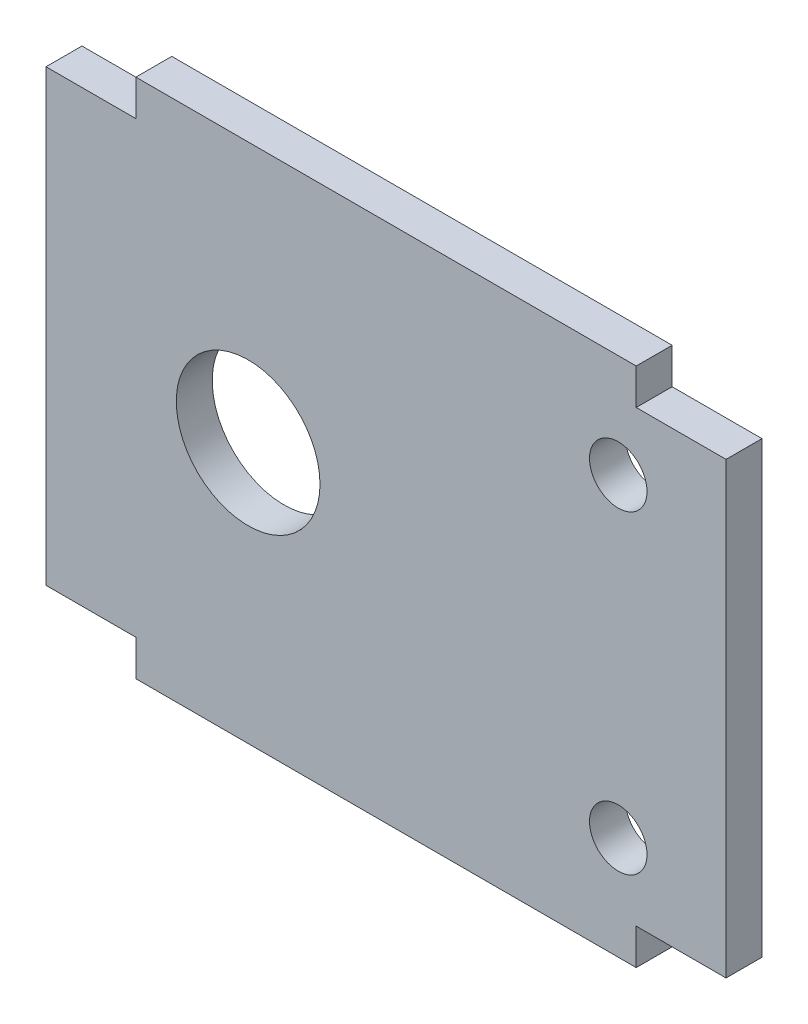
ISO-10303-21;
HEADER;
FILE_DESCRIPTION(('STEP AP214'),'2;1');
FILE_NAME('part.step','',(''),(''),'','','');
FILE_SCHEMA(('AUTOMOTIVE_DESIGN { 1 0 10303 214 1 1 1 1 }'));
ENDSEC;
DATA;
#1=APPLICATION_CONTEXT('core data for automotive mechanical design processes');
#2=APPLICATION_PROTOCOL_DEFINITION('international standard','automotive_design',2000,#1);
#3=PRODUCT_CONTEXT('',#1,'mechanical');
#4=PRODUCT('Part','Part','',(#3));
#5=PRODUCT_RELATED_PRODUCT_CATEGORY('part','',(#4));
#6=PRODUCT_DEFINITION_FORMATION('','',#4);
#7=PRODUCT_DEFINITION_CONTEXT('part definition',#1,'design');
#8=PRODUCT_DEFINITION('design','',#6,#7);
#9=PRODUCT_DEFINITION_SHAPE('','',#8);
#10=(LENGTH_UNIT() NAMED_UNIT(*) SI_UNIT(.MILLI.,.METRE.));
#11=(NAMED_UNIT(*) PLANE_ANGLE_UNIT() SI_UNIT($,.RADIAN.));
#12=(NAMED_UNIT(*) SI_UNIT($,.STERADIAN.) SOLID_ANGLE_UNIT());
#13=UNCERTAINTY_MEASURE_WITH_UNIT(LENGTH_MEASURE(1.E-05),#10,'distance_accuracy_value','');
#14=(GEOMETRIC_REPRESENTATION_CONTEXT(3) GLOBAL_UNCERTAINTY_ASSIGNED_CONTEXT((#13)) GLOBAL_UNIT_ASSIGNED_CONTEXT((#10,
#11,#12)) REPRESENTATION_CONTEXT('',''));
#15=CARTESIAN_POINT('',(0.,0.,0.));
#16=DIRECTION('',(0.,0.,1.));
#17=DIRECTION('',(1.,0.,0.));
#18=AXIS2_PLACEMENT_3D('',#15,#16,#17);
#19=CARTESIAN_POINT('',(-11.25,12.5,2.));
#20=DIRECTION('',(0.,-1.,0.));
#21=DIRECTION('',(0.,0.,-1.));
#22=AXIS2_PLACEMENT_3D('',#19,#20,#21);
#23=PLANE('',#22);
#24=DIRECTION('',(-1.,0.,0.));
#25=VECTOR('',#24,1.);
#26=CARTESIAN_POINT('',(-11.25,12.5,2.));
#27=LINE('',#26,#25);
#28=CARTESIAN_POINT('',(-6.25,12.5,2.));
#29=VERTEX_POINT('',#28);
#30=CARTESIAN_POINT('',(-11.25,12.5,2.));
#31=VERTEX_POINT('',#30);
#32=EDGE_CURVE('E208',#29,#31,#27,.T.);
#33=ORIENTED_EDGE('',*,*,#32,.F.);
#34=DIRECTION('',(0.,0.,-1.));
#35=VECTOR('',#34,1.);
#36=CARTESIAN_POINT('',(-6.25,12.5,2.));
#37=LINE('',#36,#35);
#38=CARTESIAN_POINT('',(-6.25,12.5,0.));
#39=VERTEX_POINT('',#38);
#40=EDGE_CURVE('E130',#29,#39,#37,.T.);
#41=ORIENTED_EDGE('',*,*,#40,.T.);
#42=DIRECTION('',(-1.,0.,0.));
#43=VECTOR('',#42,1.);
#44=CARTESIAN_POINT('',(-11.25,12.5,0.));
#45=LINE('',#44,#43);
#46=CARTESIAN_POINT('',(-11.25,12.5,0.));
#47=VERTEX_POINT('',#46);
#48=EDGE_CURVE('E218',#39,#47,#45,.T.);
#49=ORIENTED_EDGE('',*,*,#48,.T.);
#50=DIRECTION('',(0.,0.,-1.));
#51=VECTOR('',#50,1.);
#52=CARTESIAN_POINT('',(-11.25,12.5,2.));
#53=LINE('',#52,#51);
#54=EDGE_CURVE('E226',#31,#47,#53,.T.);
#55=ORIENTED_EDGE('',*,*,#54,.F.);
#56=EDGE_LOOP('',(#33,#41,#49,#55));
#57=FACE_BOUND('',#56,.T.);
#58=ADVANCED_FACE('F33',(#57),#23,.F.);
#59=CARTESIAN_POINT('',(-11.25,-12.5,2.));
#60=DIRECTION('',(0.,1.,0.));
#61=DIRECTION('',(0.,0.,1.));
#62=AXIS2_PLACEMENT_3D('',#59,#60,#61);
#63=PLANE('',#62);
#64=DIRECTION('',(0.,0.,-1.));
#65=VECTOR('',#64,1.);
#66=CARTESIAN_POINT('',(-6.25,-12.5,2.));
#67=LINE('',#66,#65);
#68=CARTESIAN_POINT('',(-6.25,-12.5,2.));
#69=VERTEX_POINT('',#68);
#70=CARTESIAN_POINT('',(-6.25,-12.5,0.));
#71=VERTEX_POINT('',#70);
#72=EDGE_CURVE('E56',#69,#71,#67,.T.);
#73=ORIENTED_EDGE('',*,*,#72,.F.);
#74=DIRECTION('',(1.,0.,0.));
#75=VECTOR('',#74,1.);
#76=CARTESIAN_POINT('',(-11.25,-12.5,2.));
#77=LINE('',#76,#75);
#78=CARTESIAN_POINT('',(-11.25,-12.5,2.));
#79=VERTEX_POINT('',#78);
#80=EDGE_CURVE('E203',#79,#69,#77,.T.);
#81=ORIENTED_EDGE('',*,*,#80,.F.);
#82=DIRECTION('',(0.,0.,-1.));
#83=VECTOR('',#82,1.);
#84=CARTESIAN_POINT('',(-11.25,-12.5,2.));
#85=LINE('',#84,#83);
#86=CARTESIAN_POINT('',(-11.25,-12.5,0.));
#87=VERTEX_POINT('',#86);
#88=EDGE_CURVE('E213',#79,#87,#85,.T.);
#89=ORIENTED_EDGE('',*,*,#88,.T.);
#90=DIRECTION('',(1.,0.,0.));
#91=VECTOR('',#90,1.);
#92=CARTESIAN_POINT('',(-11.25,-12.5,0.));
#93=LINE('',#92,#91);
#94=EDGE_CURVE('E214',#87,#71,#93,.T.);
#95=ORIENTED_EDGE('',*,*,#94,.T.);
#96=EDGE_LOOP('',(#73,#81,#89,#95));
#97=FACE_BOUND('',#96,.T.);
#98=ADVANCED_FACE('F35',(#97),#63,.F.);
#99=DIRECTION('',(0.,0.,1.));
#100=VECTOR('',#99,1.);
#101=CARTESIAN_POINT('',(21.6,-12.5,2.));
#102=LINE('',#101,#100);
#103=CARTESIAN_POINT('',(21.6,-12.5,0.));
#104=VERTEX_POINT('',#103);
#105=CARTESIAN_POINT('',(21.6,-12.5,2.));
#106=VERTEX_POINT('',#105);
#107=EDGE_CURVE('E163',#104,#106,#102,.T.);
#108=ORIENTED_EDGE('',*,*,#107,.F.);
#109=CARTESIAN_POINT('',(26.6,-12.5,0.));
#110=VERTEX_POINT('',#109);
#111=EDGE_CURVE('E200',#104,#110,#93,.T.);
#112=ORIENTED_EDGE('',*,*,#111,.T.);
#113=DIRECTION('',(0.,0.,-1.));
#114=VECTOR('',#113,1.);
#115=CARTESIAN_POINT('',(26.6,-12.5,2.));
#116=LINE('',#115,#114);
#117=CARTESIAN_POINT('',(26.6,-12.5,2.));
#118=VERTEX_POINT('',#117);
#119=EDGE_CURVE('E11',#118,#110,#116,.T.);
#120=ORIENTED_EDGE('',*,*,#119,.F.);
#121=EDGE_CURVE('E206',#106,#118,#77,.T.);
#122=ORIENTED_EDGE('',*,*,#121,.F.);
#123=EDGE_LOOP('',(#108,#112,#120,#122));
#124=FACE_BOUND('',#123,.T.);
#125=ADVANCED_FACE('F246',(#124),#63,.F.);
#126=CARTESIAN_POINT('',(0.,0.,2.));
#127=DIRECTION('',(0.,0.,1.));
#128=DIRECTION('',(1.,0.,0.));
#129=AXIS2_PLACEMENT_3D('',#126,#127,#128);
#130=PLANE('',#129);
#131=CARTESIAN_POINT('',(20.6,-8.75,2.));
#132=DIRECTION('',(0.,0.,1.));
#133=DIRECTION('',(1.,0.,0.));
#134=AXIS2_PLACEMENT_3D('',#131,#132,#133);
#135=CIRCLE('',#134,1.6);
#136=CARTESIAN_POINT('',(22.2,-8.75,2.));
#137=VERTEX_POINT('',#136);
#138=EDGE_CURVE('E191',#137,#137,#135,.T.);
#139=ORIENTED_EDGE('',*,*,#138,.F.);
#140=EDGE_LOOP('',(#139));
#141=FACE_BOUND('',#140,.T.);
#142=ORIENTED_EDGE('',*,*,#80,.T.);
#143=DIRECTION('',(0.,1.,0.));
#144=VECTOR('',#143,1.);
#145=CARTESIAN_POINT('',(-6.25,-14.5,2.));
#146=LINE('',#145,#144);
#147=CARTESIAN_POINT('',(-6.25,-14.5,2.));
#148=VERTEX_POINT('',#147);
#149=EDGE_CURVE('E169',#148,#69,#146,.T.);
#150=ORIENTED_EDGE('',*,*,#149,.F.);
#151=DIRECTION('',(-1.,0.,0.));
#152=VECTOR('',#151,1.);
#153=CARTESIAN_POINT('',(-6.25,-14.5,2.));
#154=LINE('',#153,#152);
#155=CARTESIAN_POINT('',(21.6,-14.5,2.));
#156=VERTEX_POINT('',#155);
#157=EDGE_CURVE('E167',#156,#148,#154,.T.);
#158=ORIENTED_EDGE('',*,*,#157,.F.);
#159=DIRECTION('',(0.,1.,0.));
#160=VECTOR('',#159,1.);
#161=CARTESIAN_POINT('',(21.6,-14.5,2.));
#162=LINE('',#161,#160);
#163=EDGE_CURVE('E175',#156,#106,#162,.T.);
#164=ORIENTED_EDGE('',*,*,#163,.T.);
#165=ORIENTED_EDGE('',*,*,#121,.T.);
#166=DIRECTION('',(0.,1.,0.));
#167=VECTOR('',#166,1.);
#168=CARTESIAN_POINT('',(26.6,-12.5,2.));
#169=LINE('',#168,#167);
#170=CARTESIAN_POINT('',(26.6,12.5,2.));
#171=VERTEX_POINT('',#170);
#172=EDGE_CURVE('E205',#118,#171,#169,.T.);
#173=ORIENTED_EDGE('',*,*,#172,.T.);
#174=CARTESIAN_POINT('',(21.6,12.5,2.));
#175=VERTEX_POINT('',#174);
#176=EDGE_CURVE('E209',#171,#175,#27,.T.);
#177=ORIENTED_EDGE('',*,*,#176,.T.);
#178=DIRECTION('',(0.,-1.,0.));
#179=VECTOR('',#178,1.);
#180=CARTESIAN_POINT('',(21.6,14.5,2.));
#181=LINE('',#180,#179);
#182=CARTESIAN_POINT('',(21.6,14.5,2.));
#183=VERTEX_POINT('',#182);
#184=EDGE_CURVE('E48',#183,#175,#181,.T.);
#185=ORIENTED_EDGE('',*,*,#184,.F.);
#186=DIRECTION('',(-1.,0.,0.));
#187=VECTOR('',#186,1.);
#188=CARTESIAN_POINT('',(-6.25,14.5,2.));
#189=LINE('',#188,#187);
#190=CARTESIAN_POINT('',(-6.25,14.5,2.));
#191=VERTEX_POINT('',#190);
#192=EDGE_CURVE('E139',#183,#191,#189,.T.);
#193=ORIENTED_EDGE('',*,*,#192,.T.);
#194=DIRECTION('',(0.,-1.,0.));
#195=VECTOR('',#194,1.);
#196=CARTESIAN_POINT('',(-6.25,14.5,2.));
#197=LINE('',#196,#195);
#198=EDGE_CURVE('E124',#191,#29,#197,.T.);
#199=ORIENTED_EDGE('',*,*,#198,.T.);
#200=ORIENTED_EDGE('',*,*,#32,.T.);
#201=DIRECTION('',(0.,-1.,0.));
#202=VECTOR('',#201,1.);
#203=CARTESIAN_POINT('',(-11.25,12.5,2.));
#204=LINE('',#203,#202);
#205=EDGE_CURVE('E211',#31,#79,#204,.T.);
#206=ORIENTED_EDGE('',*,*,#205,.T.);
#207=EDGE_LOOP('',(#142,#150,#158,#164,#165,#173,#177,#185,#193,#199,#200,#206));
#208=FACE_BOUND('',#207,.T.);
#209=CARTESIAN_POINT('',(0.,0.,2.));
#210=DIRECTION('',(0.,0.,1.));
#211=DIRECTION('',(1.,0.,0.));
#212=AXIS2_PLACEMENT_3D('',#209,#210,#211);
#213=CIRCLE('',#212,4.);
#214=CARTESIAN_POINT('',(4.,0.,2.));
#215=VERTEX_POINT('',#214);
#216=EDGE_CURVE('E197',#215,#215,#213,.T.);
#217=ORIENTED_EDGE('',*,*,#216,.F.);
#218=EDGE_LOOP('',(#217));
#219=FACE_BOUND('',#218,.T.);
#220=CARTESIAN_POINT('',(20.6,8.75,2.));
#221=DIRECTION('',(0.,0.,1.));
#222=DIRECTION('',(1.,0.,0.));
#223=AXIS2_PLACEMENT_3D('',#220,#221,#222);
#224=CIRCLE('',#223,1.6);
#225=CARTESIAN_POINT('',(22.2,8.75,2.));
#226=VERTEX_POINT('',#225);
#227=EDGE_CURVE('E185',#226,#226,#224,.T.);
#228=ORIENTED_EDGE('',*,*,#227,.F.);
#229=EDGE_LOOP('',(#228));
#230=FACE_BOUND('',#229,.T.);
#231=ADVANCED_FACE('F144',(#141,#208,#219,#230),#130,.T.);
#232=CARTESIAN_POINT('',(0.,0.,0.));
#233=DIRECTION('',(0.,0.,1.));
#234=DIRECTION('',(1.,0.,0.));
#235=AXIS2_PLACEMENT_3D('',#232,#233,#234);
#236=PLANE('',#235);
#237=ORIENTED_EDGE('',*,*,#94,.F.);
#238=DIRECTION('',(0.,-1.,0.));
#239=VECTOR('',#238,1.);
#240=CARTESIAN_POINT('',(-11.25,12.5,0.));
#241=LINE('',#240,#239);
#242=EDGE_CURVE('E222',#47,#87,#241,.T.);
#243=ORIENTED_EDGE('',*,*,#242,.F.);
#244=ORIENTED_EDGE('',*,*,#48,.F.);
#245=DIRECTION('',(0.,-1.,0.));
#246=VECTOR('',#245,1.);
#247=CARTESIAN_POINT('',(-6.25,14.5,0.));
#248=LINE('',#247,#246);
#249=CARTESIAN_POINT('',(-6.25,14.5,0.));
#250=VERTEX_POINT('',#249);
#251=EDGE_CURVE('E152',#250,#39,#248,.T.);
#252=ORIENTED_EDGE('',*,*,#251,.F.);
#253=DIRECTION('',(1.,0.,0.));
#254=VECTOR('',#253,1.);
#255=CARTESIAN_POINT('',(-6.25,14.5,0.));
#256=LINE('',#255,#254);
#257=CARTESIAN_POINT('',(21.6,14.5,0.));
#258=VERTEX_POINT('',#257);
#259=EDGE_CURVE('E141',#250,#258,#256,.T.);
#260=ORIENTED_EDGE('',*,*,#259,.T.);
#261=DIRECTION('',(0.,-1.,0.));
#262=VECTOR('',#261,1.);
#263=CARTESIAN_POINT('',(21.6,14.5,0.));
#264=LINE('',#263,#262);
#265=CARTESIAN_POINT('',(21.6,12.5,0.));
#266=VERTEX_POINT('',#265);
#267=EDGE_CURVE('E156',#258,#266,#264,.T.);
#268=ORIENTED_EDGE('',*,*,#267,.T.);
#269=CARTESIAN_POINT('',(26.6,12.5,0.));
#270=VERTEX_POINT('',#269);
#271=EDGE_CURVE('E219',#270,#266,#45,.T.);
#272=ORIENTED_EDGE('',*,*,#271,.F.);
#273=DIRECTION('',(0.,1.,0.));
#274=VECTOR('',#273,1.);
#275=CARTESIAN_POINT('',(26.6,-12.5,0.));
#276=LINE('',#275,#274);
#277=EDGE_CURVE('E216',#110,#270,#276,.T.);
#278=ORIENTED_EDGE('',*,*,#277,.F.);
#279=ORIENTED_EDGE('',*,*,#111,.F.);
#280=DIRECTION('',(0.,1.,0.));
#281=VECTOR('',#280,1.);
#282=CARTESIAN_POINT('',(21.6,-14.5,0.));
#283=LINE('',#282,#281);
#284=CARTESIAN_POINT('',(21.6,-14.5,0.));
#285=VERTEX_POINT('',#284);
#286=EDGE_CURVE('E178',#285,#104,#283,.T.);
#287=ORIENTED_EDGE('',*,*,#286,.F.);
#288=DIRECTION('',(1.,0.,0.));
#289=VECTOR('',#288,1.);
#290=CARTESIAN_POINT('',(-6.25,-14.5,0.));
#291=LINE('',#290,#289);
#292=CARTESIAN_POINT('',(-6.25,-14.5,0.));
#293=VERTEX_POINT('',#292);
#294=EDGE_CURVE('E162',#293,#285,#291,.T.);
#295=ORIENTED_EDGE('',*,*,#294,.F.);
#296=DIRECTION('',(0.,1.,0.));
#297=VECTOR('',#296,1.);
#298=CARTESIAN_POINT('',(-6.25,-14.5,0.));
#299=LINE('',#298,#297);
#300=EDGE_CURVE('E181',#293,#71,#299,.T.);
#301=ORIENTED_EDGE('',*,*,#300,.T.);
#302=EDGE_LOOP('',(#237,#243,#244,#252,#260,#268,#272,#278,#279,#287,#295,#301));
#303=FACE_BOUND('',#302,.T.);
#304=CARTESIAN_POINT('',(0.,0.,0.));
#305=DIRECTION('',(0.,0.,1.));
#306=DIRECTION('',(1.,0.,0.));
#307=AXIS2_PLACEMENT_3D('',#304,#305,#306);
#308=CIRCLE('',#307,4.);
#309=CARTESIAN_POINT('',(4.,0.,0.));
#310=VERTEX_POINT('',#309);
#311=EDGE_CURVE('E194',#310,#310,#308,.T.);
#312=ORIENTED_EDGE('',*,*,#311,.T.);
#313=EDGE_LOOP('',(#312));
#314=FACE_BOUND('',#313,.T.);
#315=CARTESIAN_POINT('',(20.6,-8.75,0.));
#316=DIRECTION('',(0.,0.,1.));
#317=DIRECTION('',(1.,0.,0.));
#318=AXIS2_PLACEMENT_3D('',#315,#316,#317);
#319=CIRCLE('',#318,1.6);
#320=CARTESIAN_POINT('',(22.2,-8.75,0.));
#321=VERTEX_POINT('',#320);
#322=EDGE_CURVE('E188',#321,#321,#319,.T.);
#323=ORIENTED_EDGE('',*,*,#322,.T.);
#324=EDGE_LOOP('',(#323));
#325=FACE_BOUND('',#324,.T.);
#326=CARTESIAN_POINT('',(20.6,8.75,0.));
#327=DIRECTION('',(0.,0.,1.));
#328=DIRECTION('',(1.,0.,0.));
#329=AXIS2_PLACEMENT_3D('',#326,#327,#328);
#330=CIRCLE('',#329,1.6);
#331=CARTESIAN_POINT('',(22.2,8.75,0.));
#332=VERTEX_POINT('',#331);
#333=EDGE_CURVE('E184',#332,#332,#330,.T.);
#334=ORIENTED_EDGE('',*,*,#333,.T.);
#335=EDGE_LOOP('',(#334));
#336=FACE_BOUND('',#335,.T.);
#337=ADVANCED_FACE('F239',(#303,#314,#325,#336),#236,.F.);
#338=CARTESIAN_POINT('',(26.6,-12.5,2.));
#339=DIRECTION('',(-1.,0.,0.));
#340=DIRECTION('',(0.,0.,1.));
#341=AXIS2_PLACEMENT_3D('',#338,#339,#340);
#342=PLANE('',#341);
#343=ORIENTED_EDGE('',*,*,#277,.T.);
#344=DIRECTION('',(0.,0.,-1.));
#345=VECTOR('',#344,1.);
#346=CARTESIAN_POINT('',(26.6,12.5,2.));
#347=LINE('',#346,#345);
#348=EDGE_CURVE('E41',#171,#270,#347,.T.);
#349=ORIENTED_EDGE('',*,*,#348,.F.);
#350=ORIENTED_EDGE('',*,*,#172,.F.);
#351=ORIENTED_EDGE('',*,*,#119,.T.);
#352=EDGE_LOOP('',(#343,#349,#350,#351));
#353=FACE_BOUND('',#352,.T.);
#354=ADVANCED_FACE('F244',(#353),#342,.F.);
#355=ORIENTED_EDGE('',*,*,#271,.T.);
#356=DIRECTION('',(0.,0.,1.));
#357=VECTOR('',#356,1.);
#358=CARTESIAN_POINT('',(21.6,12.5,2.));
#359=LINE('',#358,#357);
#360=EDGE_CURVE('E142',#266,#175,#359,.T.);
#361=ORIENTED_EDGE('',*,*,#360,.T.);
#362=ORIENTED_EDGE('',*,*,#176,.F.);
#363=ORIENTED_EDGE('',*,*,#348,.T.);
#364=EDGE_LOOP('',(#355,#361,#362,#363));
#365=FACE_BOUND('',#364,.T.);
#366=ADVANCED_FACE('F233',(#365),#23,.F.);
#367=CARTESIAN_POINT('',(-11.25,12.5,2.));
#368=DIRECTION('',(1.,0.,0.));
#369=DIRECTION('',(0.,0.,-1.));
#370=AXIS2_PLACEMENT_3D('',#367,#368,#369);
#371=PLANE('',#370);
#372=ORIENTED_EDGE('',*,*,#242,.T.);
#373=ORIENTED_EDGE('',*,*,#88,.F.);
#374=ORIENTED_EDGE('',*,*,#205,.F.);
#375=ORIENTED_EDGE('',*,*,#54,.T.);
#376=EDGE_LOOP('',(#372,#373,#374,#375));
#377=FACE_BOUND('',#376,.T.);
#378=ADVANCED_FACE('F264',(#377),#371,.F.);
#379=CARTESIAN_POINT('',(0.,0.,2.));
#380=DIRECTION('',(0.,0.,-1.));
#381=DIRECTION('',(-1.,0.,0.));
#382=AXIS2_PLACEMENT_3D('',#379,#380,#381);
#383=CYLINDRICAL_SURFACE('',#382,4.);
#384=ORIENTED_EDGE('',*,*,#216,.T.);
#385=EDGE_LOOP('',(#384));
#386=FACE_BOUND('',#385,.T.);
#387=ORIENTED_EDGE('',*,*,#311,.F.);
#388=EDGE_LOOP('',(#387));
#389=FACE_BOUND('',#388,.T.);
#390=ADVANCED_FACE('F279',(#386,#389),#383,.F.);
#391=CARTESIAN_POINT('',(20.6,-8.75,2.));
#392=DIRECTION('',(0.,0.,-1.));
#393=DIRECTION('',(-1.,0.,0.));
#394=AXIS2_PLACEMENT_3D('',#391,#392,#393);
#395=CYLINDRICAL_SURFACE('',#394,1.6);
#396=ORIENTED_EDGE('',*,*,#138,.T.);
#397=EDGE_LOOP('',(#396));
#398=FACE_BOUND('',#397,.T.);
#399=ORIENTED_EDGE('',*,*,#322,.F.);
#400=EDGE_LOOP('',(#399));
#401=FACE_BOUND('',#400,.T.);
#402=ADVANCED_FACE('F292',(#398,#401),#395,.F.);
#403=CARTESIAN_POINT('',(20.6,8.75,2.));
#404=DIRECTION('',(0.,0.,-1.));
#405=DIRECTION('',(-1.,0.,0.));
#406=AXIS2_PLACEMENT_3D('',#403,#404,#405);
#407=CYLINDRICAL_SURFACE('',#406,1.6);
#408=ORIENTED_EDGE('',*,*,#227,.T.);
#409=EDGE_LOOP('',(#408));
#410=FACE_BOUND('',#409,.T.);
#411=ORIENTED_EDGE('',*,*,#333,.F.);
#412=EDGE_LOOP('',(#411));
#413=FACE_BOUND('',#412,.T.);
#414=ADVANCED_FACE('F296',(#410,#413),#407,.F.);
#415=CARTESIAN_POINT('',(-6.25,-14.5,2.));
#416=DIRECTION('',(1.,0.,0.));
#417=DIRECTION('',(0.,0.,-1.));
#418=AXIS2_PLACEMENT_3D('',#415,#416,#417);
#419=PLANE('',#418);
#420=ORIENTED_EDGE('',*,*,#72,.T.);
#421=ORIENTED_EDGE('',*,*,#300,.F.);
#422=DIRECTION('',(0.,0.,-1.));
#423=VECTOR('',#422,1.);
#424=CARTESIAN_POINT('',(-6.25,-14.5,2.));
#425=LINE('',#424,#423);
#426=EDGE_CURVE('E159',#148,#293,#425,.T.);
#427=ORIENTED_EDGE('',*,*,#426,.F.);
#428=ORIENTED_EDGE('',*,*,#149,.T.);
#429=EDGE_LOOP('',(#420,#421,#427,#428));
#430=FACE_BOUND('',#429,.T.);
#431=ADVANCED_FACE('F260',(#430),#419,.F.);
#432=CARTESIAN_POINT('',(21.6,-14.5,2.));
#433=DIRECTION('',(-1.,0.,0.));
#434=DIRECTION('',(0.,0.,1.));
#435=AXIS2_PLACEMENT_3D('',#432,#433,#434);
#436=PLANE('',#435);
#437=ORIENTED_EDGE('',*,*,#107,.T.);
#438=ORIENTED_EDGE('',*,*,#163,.F.);
#439=DIRECTION('',(0.,0.,1.));
#440=VECTOR('',#439,1.);
#441=CARTESIAN_POINT('',(21.6,-14.5,2.));
#442=LINE('',#441,#440);
#443=EDGE_CURVE('E165',#285,#156,#442,.T.);
#444=ORIENTED_EDGE('',*,*,#443,.F.);
#445=ORIENTED_EDGE('',*,*,#286,.T.);
#446=EDGE_LOOP('',(#437,#438,#444,#445));
#447=FACE_BOUND('',#446,.T.);
#448=ADVANCED_FACE('F250',(#447),#436,.F.);
#449=CARTESIAN_POINT('',(0.,-14.5,0.));
#450=DIRECTION('',(0.,-1.,0.));
#451=DIRECTION('',(0.,0.,-1.));
#452=AXIS2_PLACEMENT_3D('',#449,#450,#451);
#453=PLANE('',#452);
#454=ORIENTED_EDGE('',*,*,#426,.T.);
#455=ORIENTED_EDGE('',*,*,#294,.T.);
#456=ORIENTED_EDGE('',*,*,#443,.T.);
#457=ORIENTED_EDGE('',*,*,#157,.T.);
#458=EDGE_LOOP('',(#454,#455,#456,#457));
#459=FACE_BOUND('',#458,.T.);
#460=ADVANCED_FACE('F254',(#459),#453,.T.);
#461=CARTESIAN_POINT('',(-6.25,14.5,2.));
#462=DIRECTION('',(-1.,0.,0.));
#463=DIRECTION('',(0.,0.,1.));
#464=AXIS2_PLACEMENT_3D('',#461,#462,#463);
#465=PLANE('',#464);
#466=ORIENTED_EDGE('',*,*,#40,.F.);
#467=ORIENTED_EDGE('',*,*,#198,.F.);
#468=DIRECTION('',(0.,0.,-1.));
#469=VECTOR('',#468,1.);
#470=CARTESIAN_POINT('',(-6.25,14.5,2.));
#471=LINE('',#470,#469);
#472=EDGE_CURVE('E127',#191,#250,#471,.T.);
#473=ORIENTED_EDGE('',*,*,#472,.T.);
#474=ORIENTED_EDGE('',*,*,#251,.T.);
#475=EDGE_LOOP('',(#466,#467,#473,#474));
#476=FACE_BOUND('',#475,.T.);
#477=ADVANCED_FACE('F126',(#476),#465,.T.);
#478=CARTESIAN_POINT('',(21.6,14.5,2.));
#479=DIRECTION('',(1.,0.,0.));
#480=DIRECTION('',(0.,0.,-1.));
#481=AXIS2_PLACEMENT_3D('',#478,#479,#480);
#482=PLANE('',#481);
#483=ORIENTED_EDGE('',*,*,#360,.F.);
#484=ORIENTED_EDGE('',*,*,#267,.F.);
#485=DIRECTION('',(0.,0.,1.));
#486=VECTOR('',#485,1.);
#487=CARTESIAN_POINT('',(21.6,14.5,2.));
#488=LINE('',#487,#486);
#489=EDGE_CURVE('E147',#258,#183,#488,.T.);
#490=ORIENTED_EDGE('',*,*,#489,.T.);
#491=ORIENTED_EDGE('',*,*,#184,.T.);
#492=EDGE_LOOP('',(#483,#484,#490,#491));
#493=FACE_BOUND('',#492,.T.);
#494=ADVANCED_FACE('F242',(#493),#482,.T.);
#495=CARTESIAN_POINT('',(0.,14.5,0.));
#496=DIRECTION('',(0.,1.,0.));
#497=DIRECTION('',(0.,0.,-1.));
#498=AXIS2_PLACEMENT_3D('',#495,#496,#497);
#499=PLANE('',#498);
#500=ORIENTED_EDGE('',*,*,#472,.F.);
#501=ORIENTED_EDGE('',*,*,#192,.F.);
#502=ORIENTED_EDGE('',*,*,#489,.F.);
#503=ORIENTED_EDGE('',*,*,#259,.F.);
#504=EDGE_LOOP('',(#500,#501,#502,#503));
#505=FACE_BOUND('',#504,.T.);
#506=ADVANCED_FACE('F137',(#505),#499,.T.);
#507=CLOSED_SHELL('',(#58,#98,#125,#231,#337,#354,#366,#378,#390,#402,#414,#431,#448,#460,#477,
#494,#506));
#508=MANIFOLD_SOLID_BREP('B2',#507);
#509=ADVANCED_BREP_SHAPE_REPRESENTATION('',(#18,#508),#14);
#510=SHAPE_DEFINITION_REPRESENTATION(#9,#509);
ENDSEC;
END-ISO-10303-21;
